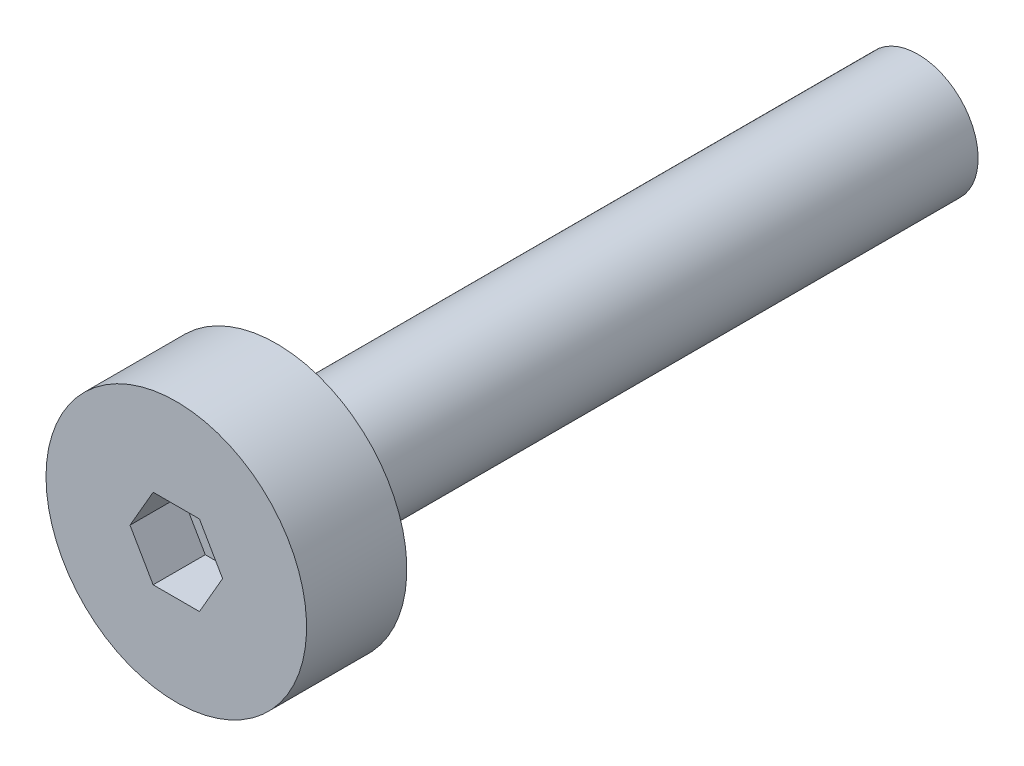
ISO-10303-21;
HEADER;
FILE_DESCRIPTION(('STEP AP214'),'2;1');
FILE_NAME('part.step','',(''),(''),'','','');
FILE_SCHEMA(('AUTOMOTIVE_DESIGN { 1 0 10303 214 1 1 1 1 }'));
ENDSEC;
DATA;
#1=APPLICATION_CONTEXT('core data for automotive mechanical design processes');
#2=APPLICATION_PROTOCOL_DEFINITION('international standard','automotive_design',2000,#1);
#3=PRODUCT_CONTEXT('',#1,'mechanical');
#4=PRODUCT('Part','Part','',(#3));
#5=PRODUCT_RELATED_PRODUCT_CATEGORY('part','',(#4));
#6=PRODUCT_DEFINITION_FORMATION('','',#4);
#7=PRODUCT_DEFINITION_CONTEXT('part definition',#1,'design');
#8=PRODUCT_DEFINITION('design','',#6,#7);
#9=PRODUCT_DEFINITION_SHAPE('','',#8);
#10=(LENGTH_UNIT() NAMED_UNIT(*) SI_UNIT(.MILLI.,.METRE.));
#11=(NAMED_UNIT(*) PLANE_ANGLE_UNIT() SI_UNIT($,.RADIAN.));
#12=(NAMED_UNIT(*) SI_UNIT($,.STERADIAN.) SOLID_ANGLE_UNIT());
#13=UNCERTAINTY_MEASURE_WITH_UNIT(LENGTH_MEASURE(1.E-05),#10,'distance_accuracy_value','');
#14=(GEOMETRIC_REPRESENTATION_CONTEXT(3) GLOBAL_UNCERTAINTY_ASSIGNED_CONTEXT((#13)) GLOBAL_UNIT_ASSIGNED_CONTEXT((#10,
#11,#12)) REPRESENTATION_CONTEXT('',''));
#15=CARTESIAN_POINT('',(0.,0.,0.));
#16=DIRECTION('',(0.,0.,1.));
#17=DIRECTION('',(1.,0.,0.));
#18=AXIS2_PLACEMENT_3D('',#15,#16,#17);
#19=CARTESIAN_POINT('',(0.,0.,1.2));
#20=DIRECTION('',(0.,0.,1.));
#21=DIRECTION('',(1.,0.,0.));
#22=AXIS2_PLACEMENT_3D('',#19,#20,#21);
#23=PLANE('',#22);
#24=DIRECTION('',(-0.50000000000019,0.866025403784329,0.));
#25=VECTOR('',#24,1.);
#26=CARTESIAN_POINT('',(1.154700538379,0.,1.2));
#27=LINE('',#26,#25);
#28=CARTESIAN_POINT('',(1.154700538379,0.,1.2));
#29=VERTEX_POINT('',#28);
#30=CARTESIAN_POINT('',(0.57735026919,1.,1.2));
#31=VERTEX_POINT('',#30);
#32=EDGE_CURVE('E10',#29,#31,#27,.T.);
#33=ORIENTED_EDGE('',*,*,#32,.T.);
#34=DIRECTION('',(-1.,0.,0.));
#35=VECTOR('',#34,1.);
#36=CARTESIAN_POINT('',(0.57735026919,1.,1.2));
#37=LINE('',#36,#35);
#38=CARTESIAN_POINT('',(-0.57735026919,1.,1.2));
#39=VERTEX_POINT('',#38);
#40=EDGE_CURVE('E151',#31,#39,#37,.T.);
#41=ORIENTED_EDGE('',*,*,#40,.T.);
#42=DIRECTION('',(-0.50000000000019,-0.866025403784329,0.));
#43=VECTOR('',#42,1.);
#44=CARTESIAN_POINT('',(-0.57735026919,1.,1.2));
#45=LINE('',#44,#43);
#46=CARTESIAN_POINT('',(-1.154700538379,0.,1.2));
#47=VERTEX_POINT('',#46);
#48=EDGE_CURVE('E147',#39,#47,#45,.T.);
#49=ORIENTED_EDGE('',*,*,#48,.T.);
#50=DIRECTION('',(0.50000000000019,-0.866025403784329,0.));
#51=VECTOR('',#50,1.);
#52=CARTESIAN_POINT('',(-1.154700538379,0.,1.2));
#53=LINE('',#52,#51);
#54=CARTESIAN_POINT('',(-0.57735026919,-1.,1.2));
#55=VERTEX_POINT('',#54);
#56=EDGE_CURVE('E140',#47,#55,#53,.T.);
#57=ORIENTED_EDGE('',*,*,#56,.T.);
#58=DIRECTION('',(1.,0.,0.));
#59=VECTOR('',#58,1.);
#60=CARTESIAN_POINT('',(-0.57735026919,-1.,1.2));
#61=LINE('',#60,#59);
#62=CARTESIAN_POINT('',(0.57735026919,-1.,1.2));
#63=VERTEX_POINT('',#62);
#64=EDGE_CURVE('E118',#55,#63,#61,.T.);
#65=ORIENTED_EDGE('',*,*,#64,.T.);
#66=DIRECTION('',(0.50000000000019,0.866025403784329,0.));
#67=VECTOR('',#66,1.);
#68=CARTESIAN_POINT('',(0.57735026919,-1.,1.2));
#69=LINE('',#68,#67);
#70=EDGE_CURVE('E103',#63,#29,#69,.T.);
#71=ORIENTED_EDGE('',*,*,#70,.T.);
#72=EDGE_LOOP('',(#33,#41,#49,#57,#65,#71));
#73=FACE_BOUND('',#72,.T.);
#74=ADVANCED_FACE('F15',(#73),#23,.T.);
#75=CARTESIAN_POINT('',(0.,0.,-16.));
#76=DIRECTION('',(0.,0.,-1.));
#77=DIRECTION('',(0.,-1.,0.));
#78=AXIS2_PLACEMENT_3D('',#75,#76,#77);
#79=PLANE('',#78);
#80=CARTESIAN_POINT('',(0.,0.,-16.));
#81=DIRECTION('',(0.,0.,-1.));
#82=DIRECTION('',(-1.,0.,0.));
#83=AXIS2_PLACEMENT_3D('',#80,#81,#82);
#84=CIRCLE('',#83,1.5);
#85=CARTESIAN_POINT('',(-1.5,0.,-16.));
#86=VERTEX_POINT('',#85);
#87=EDGE_CURVE('E99',#86,#86,#84,.T.);
#88=ORIENTED_EDGE('',*,*,#87,.T.);
#89=EDGE_LOOP('',(#88));
#90=FACE_BOUND('',#89,.T.);
#91=ADVANCED_FACE('F106',(#90),#79,.T.);
#92=CARTESIAN_POINT('',(1.154700538379,0.,1.2));
#93=DIRECTION('',(-0.866025403784329,-0.50000000000019,0.));
#94=DIRECTION('',(-0.50000000000019,0.866025403784329,0.));
#95=AXIS2_PLACEMENT_3D('',#92,#93,#94);
#96=PLANE('',#95);
#97=ORIENTED_EDGE('',*,*,#32,.F.);
#98=DIRECTION('',(0.,0.,1.));
#99=VECTOR('',#98,1.);
#100=CARTESIAN_POINT('',(1.154700538379,0.,1.2));
#101=LINE('',#100,#99);
#102=CARTESIAN_POINT('',(1.154700538379,0.,2.5));
#103=VERTEX_POINT('',#102);
#104=EDGE_CURVE('E156',#29,#103,#101,.T.);
#105=ORIENTED_EDGE('',*,*,#104,.T.);
#106=DIRECTION('',(-0.50000000000019,0.866025403784329,0.));
#107=VECTOR('',#106,1.);
#108=CARTESIAN_POINT('',(1.010362971082,0.25,2.5));
#109=LINE('',#108,#107);
#110=CARTESIAN_POINT('',(0.57735026919,1.,2.5));
#111=VERTEX_POINT('',#110);
#112=EDGE_CURVE('E19',#103,#111,#109,.T.);
#113=ORIENTED_EDGE('',*,*,#112,.T.);
#114=DIRECTION('',(0.,0.,1.));
#115=VECTOR('',#114,1.);
#116=CARTESIAN_POINT('',(0.57735026919,1.,1.2));
#117=LINE('',#116,#115);
#118=EDGE_CURVE('E26',#31,#111,#117,.T.);
#119=ORIENTED_EDGE('',*,*,#118,.F.);
#120=EDGE_LOOP('',(#97,#105,#113,#119));
#121=FACE_BOUND('',#120,.T.);
#122=ADVANCED_FACE('F226',(#121),#96,.T.);
#123=CARTESIAN_POINT('',(0.57735026919,1.,1.2));
#124=DIRECTION('',(0.,-1.,0.));
#125=DIRECTION('',(-1.,0.,0.));
#126=AXIS2_PLACEMENT_3D('',#123,#124,#125);
#127=PLANE('',#126);
#128=ORIENTED_EDGE('',*,*,#40,.F.);
#129=ORIENTED_EDGE('',*,*,#118,.T.);
#130=DIRECTION('',(-1.,0.,0.));
#131=VECTOR('',#130,1.);
#132=CARTESIAN_POINT('',(0.288675134595,1.,2.5));
#133=LINE('',#132,#131);
#134=CARTESIAN_POINT('',(-0.57735026919,1.,2.5));
#135=VERTEX_POINT('',#134);
#136=EDGE_CURVE('E132',#111,#135,#133,.T.);
#137=ORIENTED_EDGE('',*,*,#136,.T.);
#138=DIRECTION('',(0.,0.,1.));
#139=VECTOR('',#138,1.);
#140=CARTESIAN_POINT('',(-0.57735026919,1.,1.2));
#141=LINE('',#140,#139);
#142=EDGE_CURVE('E148',#39,#135,#141,.T.);
#143=ORIENTED_EDGE('',*,*,#142,.F.);
#144=EDGE_LOOP('',(#128,#129,#137,#143));
#145=FACE_BOUND('',#144,.T.);
#146=ADVANCED_FACE('F197',(#145),#127,.T.);
#147=CARTESIAN_POINT('',(-0.57735026919,1.,1.2));
#148=DIRECTION('',(0.866025403784329,-0.50000000000019,0.));
#149=DIRECTION('',(0.,0.,-1.));
#150=AXIS2_PLACEMENT_3D('',#147,#148,#149);
#151=PLANE('',#150);
#152=ORIENTED_EDGE('',*,*,#48,.F.);
#153=ORIENTED_EDGE('',*,*,#142,.T.);
#154=DIRECTION('',(-0.50000000000019,-0.866025403784329,0.));
#155=VECTOR('',#154,1.);
#156=CARTESIAN_POINT('',(-0.721687836487,0.75,2.5));
#157=LINE('',#156,#155);
#158=CARTESIAN_POINT('',(-1.154700538379,0.,2.5));
#159=VERTEX_POINT('',#158);
#160=EDGE_CURVE('E136',#135,#159,#157,.T.);
#161=ORIENTED_EDGE('',*,*,#160,.T.);
#162=DIRECTION('',(0.,0.,1.));
#163=VECTOR('',#162,1.);
#164=CARTESIAN_POINT('',(-1.154700538379,0.,1.2));
#165=LINE('',#164,#163);
#166=EDGE_CURVE('E144',#47,#159,#165,.T.);
#167=ORIENTED_EDGE('',*,*,#166,.F.);
#168=EDGE_LOOP('',(#152,#153,#161,#167));
#169=FACE_BOUND('',#168,.T.);
#170=ADVANCED_FACE('F17',(#169),#151,.T.);
#171=CARTESIAN_POINT('',(-1.154700538379,0.,1.2));
#172=DIRECTION('',(0.866025403784329,0.50000000000019,0.));
#173=DIRECTION('',(0.,0.,-1.));
#174=AXIS2_PLACEMENT_3D('',#171,#172,#173);
#175=PLANE('',#174);
#176=ORIENTED_EDGE('',*,*,#56,.F.);
#177=ORIENTED_EDGE('',*,*,#166,.T.);
#178=DIRECTION('',(0.50000000000019,-0.866025403784329,0.));
#179=VECTOR('',#178,1.);
#180=CARTESIAN_POINT('',(-1.010362971082,-0.25,2.5));
#181=LINE('',#180,#179);
#182=CARTESIAN_POINT('',(-0.57735026919,-1.,2.5));
#183=VERTEX_POINT('',#182);
#184=EDGE_CURVE('E130',#159,#183,#181,.T.);
#185=ORIENTED_EDGE('',*,*,#184,.T.);
#186=DIRECTION('',(0.,0.,1.));
#187=VECTOR('',#186,1.);
#188=CARTESIAN_POINT('',(-0.57735026919,-1.,1.2));
#189=LINE('',#188,#187);
#190=EDGE_CURVE('E137',#55,#183,#189,.T.);
#191=ORIENTED_EDGE('',*,*,#190,.F.);
#192=EDGE_LOOP('',(#176,#177,#185,#191));
#193=FACE_BOUND('',#192,.T.);
#194=ADVANCED_FACE('F168',(#193),#175,.T.);
#195=CARTESIAN_POINT('',(-0.57735026919,-1.,1.2));
#196=DIRECTION('',(0.,1.,0.));
#197=DIRECTION('',(1.,0.,0.));
#198=AXIS2_PLACEMENT_3D('',#195,#196,#197);
#199=PLANE('',#198);
#200=ORIENTED_EDGE('',*,*,#64,.F.);
#201=ORIENTED_EDGE('',*,*,#190,.T.);
#202=DIRECTION('',(1.,0.,0.));
#203=VECTOR('',#202,1.);
#204=CARTESIAN_POINT('',(-0.288675134595,-1.,2.5));
#205=LINE('',#204,#203);
#206=CARTESIAN_POINT('',(0.57735026919,-1.,2.5));
#207=VERTEX_POINT('',#206);
#208=EDGE_CURVE('E127',#183,#207,#205,.T.);
#209=ORIENTED_EDGE('',*,*,#208,.T.);
#210=DIRECTION('',(0.,0.,1.));
#211=VECTOR('',#210,1.);
#212=CARTESIAN_POINT('',(0.57735026919,-1.,1.2));
#213=LINE('',#212,#211);
#214=EDGE_CURVE('E154',#63,#207,#213,.T.);
#215=ORIENTED_EDGE('',*,*,#214,.F.);
#216=EDGE_LOOP('',(#200,#201,#209,#215));
#217=FACE_BOUND('',#216,.T.);
#218=ADVANCED_FACE('F172',(#217),#199,.T.);
#219=CARTESIAN_POINT('',(0.57735026919,-1.,1.2));
#220=DIRECTION('',(-0.866025403784329,0.50000000000019,0.));
#221=DIRECTION('',(0.,0.,1.));
#222=AXIS2_PLACEMENT_3D('',#219,#220,#221);
#223=PLANE('',#222);
#224=ORIENTED_EDGE('',*,*,#70,.F.);
#225=ORIENTED_EDGE('',*,*,#214,.T.);
#226=DIRECTION('',(0.50000000000019,0.866025403784329,0.));
#227=VECTOR('',#226,1.);
#228=CARTESIAN_POINT('',(0.721687836487,-0.75,2.5));
#229=LINE('',#228,#227);
#230=EDGE_CURVE('E108',#207,#103,#229,.T.);
#231=ORIENTED_EDGE('',*,*,#230,.T.);
#232=ORIENTED_EDGE('',*,*,#104,.F.);
#233=EDGE_LOOP('',(#224,#225,#231,#232));
#234=FACE_BOUND('',#233,.T.);
#235=ADVANCED_FACE('F210',(#234),#223,.T.);
#236=CARTESIAN_POINT('',(0.,0.,0.));
#237=DIRECTION('',(0.,0.,-1.));
#238=DIRECTION('',(-1.,0.,0.));
#239=AXIS2_PLACEMENT_3D('',#236,#237,#238);
#240=CYLINDRICAL_SURFACE('',#239,1.5);
#241=ORIENTED_EDGE('',*,*,#87,.F.);
#242=DIRECTION('',(0.,0.,-1.));
#243=VECTOR('',#242,1.);
#244=CARTESIAN_POINT('',(-1.5,0.,0.));
#245=LINE('',#244,#243);
#246=CARTESIAN_POINT('',(-1.5,0.,0.));
#247=VERTEX_POINT('',#246);
#248=EDGE_CURVE('E96',#247,#86,#245,.T.);
#249=ORIENTED_EDGE('',*,*,#248,.F.);
#250=CARTESIAN_POINT('',(0.,0.,0.));
#251=DIRECTION('',(0.,0.,-1.));
#252=DIRECTION('',(-1.,0.,0.));
#253=AXIS2_PLACEMENT_3D('',#250,#251,#252);
#254=CIRCLE('',#253,1.5);
#255=EDGE_CURVE('E101',#247,#247,#254,.T.);
#256=ORIENTED_EDGE('',*,*,#255,.T.);
#257=ORIENTED_EDGE('',*,*,#248,.T.);
#258=EDGE_LOOP('',(#241,#249,#256,#257));
#259=FACE_BOUND('',#258,.T.);
#260=ADVANCED_FACE('F98',(#259),#240,.T.);
#261=CARTESIAN_POINT('',(0.,0.,2.5));
#262=DIRECTION('',(0.,0.,-1.));
#263=DIRECTION('',(0.,-1.,0.));
#264=AXIS2_PLACEMENT_3D('',#261,#262,#263);
#265=PLANE('',#264);
#266=ORIENTED_EDGE('',*,*,#208,.F.);
#267=ORIENTED_EDGE('',*,*,#184,.F.);
#268=ORIENTED_EDGE('',*,*,#160,.F.);
#269=ORIENTED_EDGE('',*,*,#136,.F.);
#270=ORIENTED_EDGE('',*,*,#112,.F.);
#271=ORIENTED_EDGE('',*,*,#230,.F.);
#272=EDGE_LOOP('',(#266,#267,#268,#269,#270,#271));
#273=FACE_BOUND('',#272,.T.);
#274=CARTESIAN_POINT('',(0.,0.,2.5));
#275=DIRECTION('',(0.,0.,-1.));
#276=DIRECTION('',(-1.,0.,0.));
#277=AXIS2_PLACEMENT_3D('',#274,#275,#276);
#278=CIRCLE('',#277,3.25);
#279=CARTESIAN_POINT('',(-3.25,0.,2.5));
#280=VERTEX_POINT('',#279);
#281=EDGE_CURVE('E126',#280,#280,#278,.T.);
#282=ORIENTED_EDGE('',*,*,#281,.F.);
#283=EDGE_LOOP('',(#282));
#284=FACE_BOUND('',#283,.T.);
#285=ADVANCED_FACE('F205',(#273,#284),#265,.F.);
#286=CARTESIAN_POINT('',(0.,0.,0.));
#287=DIRECTION('',(0.,0.,-1.));
#288=DIRECTION('',(0.,-1.,0.));
#289=AXIS2_PLACEMENT_3D('',#286,#287,#288);
#290=PLANE('',#289);
#291=ORIENTED_EDGE('',*,*,#255,.F.);
#292=EDGE_LOOP('',(#291));
#293=FACE_BOUND('',#292,.T.);
#294=CARTESIAN_POINT('',(0.,0.,0.));
#295=DIRECTION('',(0.,0.,-1.));
#296=DIRECTION('',(-1.,0.,0.));
#297=AXIS2_PLACEMENT_3D('',#294,#295,#296);
#298=CIRCLE('',#297,3.25);
#299=CARTESIAN_POINT('',(-3.25,0.,0.));
#300=VERTEX_POINT('',#299);
#301=EDGE_CURVE('E120',#300,#300,#298,.T.);
#302=ORIENTED_EDGE('',*,*,#301,.T.);
#303=EDGE_LOOP('',(#302));
#304=FACE_BOUND('',#303,.T.);
#305=ADVANCED_FACE('F231',(#293,#304),#290,.T.);
#306=CARTESIAN_POINT('',(0.,0.,2.5));
#307=DIRECTION('',(0.,0.,-1.));
#308=DIRECTION('',(-1.,0.,0.));
#309=AXIS2_PLACEMENT_3D('',#306,#307,#308);
#310=CYLINDRICAL_SURFACE('',#309,3.25);
#311=ORIENTED_EDGE('',*,*,#301,.F.);
#312=DIRECTION('',(0.,0.,-1.));
#313=VECTOR('',#312,1.);
#314=CARTESIAN_POINT('',(-3.25,0.,2.5));
#315=LINE('',#314,#313);
#316=EDGE_CURVE('E123',#280,#300,#315,.T.);
#317=ORIENTED_EDGE('',*,*,#316,.F.);
#318=ORIENTED_EDGE('',*,*,#281,.T.);
#319=ORIENTED_EDGE('',*,*,#316,.T.);
#320=EDGE_LOOP('',(#311,#317,#318,#319));
#321=FACE_BOUND('',#320,.T.);
#322=ADVANCED_FACE('F236',(#321),#310,.T.);
#323=CLOSED_SHELL('',(#74,#91,#122,#146,#170,#194,#218,#235,#260,#285,#305,#322));
#324=MANIFOLD_SOLID_BREP('B1',#323);
#325=ADVANCED_BREP_SHAPE_REPRESENTATION('',(#18,#324),#14);
#326=SHAPE_DEFINITION_REPRESENTATION(#9,#325);
ENDSEC;
END-ISO-10303-21;
